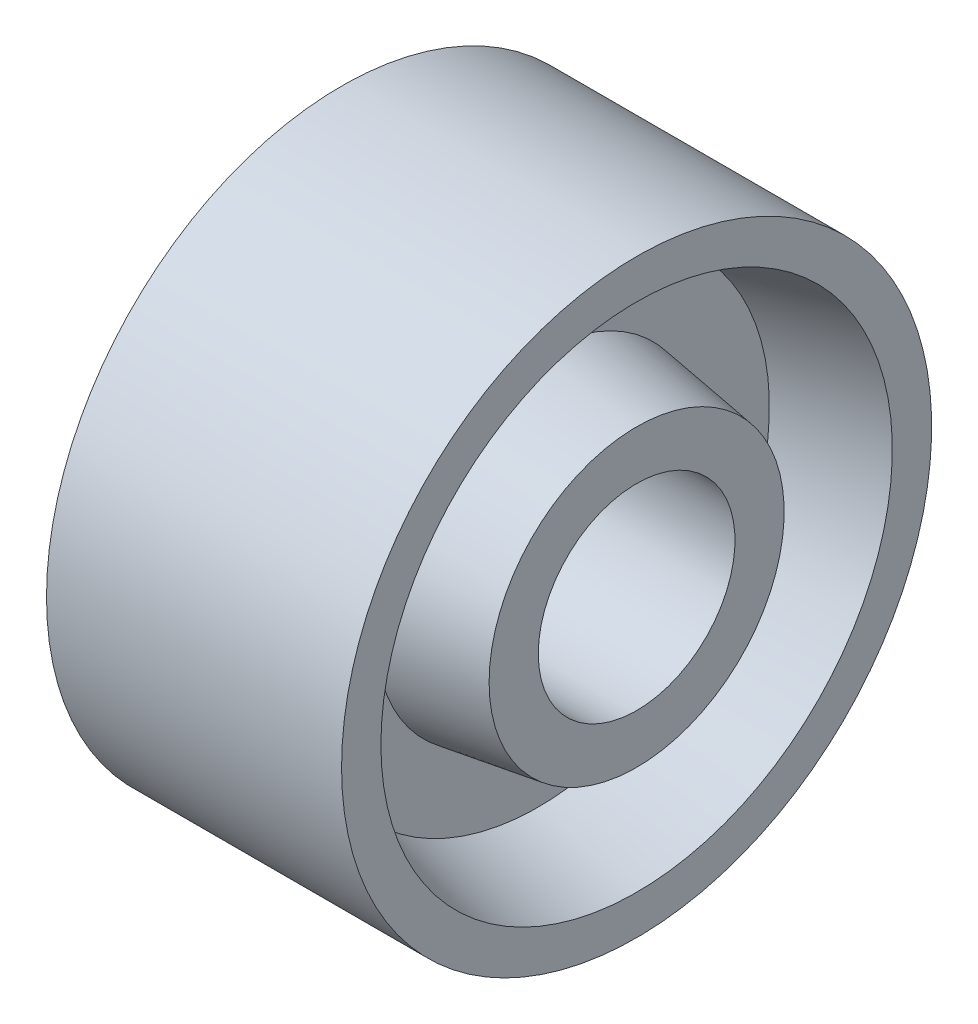
ISO-10303-21;
HEADER;
FILE_DESCRIPTION(('STEP AP214'),'2;1');
FILE_NAME('part.step','',(''),(''),'','','');
FILE_SCHEMA(('AUTOMOTIVE_DESIGN { 1 0 10303 214 1 1 1 1 }'));
ENDSEC;
DATA;
#1=APPLICATION_CONTEXT('core data for automotive mechanical design processes');
#2=APPLICATION_PROTOCOL_DEFINITION('international standard','automotive_design',2000,#1);
#3=PRODUCT_CONTEXT('',#1,'mechanical');
#4=PRODUCT('Part','Part','',(#3));
#5=PRODUCT_RELATED_PRODUCT_CATEGORY('part','',(#4));
#6=PRODUCT_DEFINITION_FORMATION('','',#4);
#7=PRODUCT_DEFINITION_CONTEXT('part definition',#1,'design');
#8=PRODUCT_DEFINITION('design','',#6,#7);
#9=PRODUCT_DEFINITION_SHAPE('','',#8);
#10=(LENGTH_UNIT() NAMED_UNIT(*) SI_UNIT(.MILLI.,.METRE.));
#11=(NAMED_UNIT(*) PLANE_ANGLE_UNIT() SI_UNIT($,.RADIAN.));
#12=(NAMED_UNIT(*) SI_UNIT($,.STERADIAN.) SOLID_ANGLE_UNIT());
#13=UNCERTAINTY_MEASURE_WITH_UNIT(LENGTH_MEASURE(1.E-05),#10,'distance_accuracy_value','');
#14=(GEOMETRIC_REPRESENTATION_CONTEXT(3) GLOBAL_UNCERTAINTY_ASSIGNED_CONTEXT((#13)) GLOBAL_UNIT_ASSIGNED_CONTEXT((#10,
#11,#12)) REPRESENTATION_CONTEXT('',''));
#15=CARTESIAN_POINT('',(0.,0.,0.));
#16=DIRECTION('',(0.,0.,1.));
#17=DIRECTION('',(1.,0.,0.));
#18=AXIS2_PLACEMENT_3D('',#15,#16,#17);
#19=CARTESIAN_POINT('',(0.,10.,0.));
#20=DIRECTION('',(1.,0.,0.));
#21=DIRECTION('',(0.,0.,-1.));
#22=AXIS2_PLACEMENT_3D('',#19,#20,#21);
#23=PLANE('',#22);
#24=CARTESIAN_POINT('',(0.,0.,0.));
#25=DIRECTION('',(-1.,0.,0.));
#26=DIRECTION('',(0.,0.,1.));
#27=AXIS2_PLACEMENT_3D('',#24,#25,#26);
#28=CIRCLE('',#27,10.);
#29=CARTESIAN_POINT('',(0.,0.,10.));
#30=VERTEX_POINT('',#29);
#31=EDGE_CURVE('E94',#30,#30,#28,.T.);
#32=ORIENTED_EDGE('',*,*,#31,.F.);
#33=EDGE_LOOP('',(#32));
#34=FACE_BOUND('',#33,.T.);
#35=CARTESIAN_POINT('',(0.,0.,0.));
#36=DIRECTION('',(-1.,0.,0.));
#37=DIRECTION('',(0.,0.,1.));
#38=AXIS2_PLACEMENT_3D('',#35,#36,#37);
#39=CIRCLE('',#38,15.);
#40=CARTESIAN_POINT('',(0.,0.,15.));
#41=VERTEX_POINT('',#40);
#42=EDGE_CURVE('E10',#41,#41,#39,.T.);
#43=ORIENTED_EDGE('',*,*,#42,.T.);
#44=EDGE_LOOP('',(#43));
#45=FACE_BOUND('',#44,.T.);
#46=ADVANCED_FACE('F43',(#34,#45),#23,.F.);
#47=CARTESIAN_POINT('',(10.,0.,0.));
#48=DIRECTION('',(1.,0.,0.));
#49=DIRECTION('',(0.,0.,-1.));
#50=AXIS2_PLACEMENT_3D('',#47,#48,#49);
#51=CONICAL_SURFACE('',#50,16.5,0.148889947609497);
#52=ORIENTED_EDGE('',*,*,#42,.F.);
#53=EDGE_LOOP('',(#52));
#54=FACE_BOUND('',#53,.T.);
#55=CARTESIAN_POINT('',(10.,0.,0.));
#56=DIRECTION('',(-1.,0.,0.));
#57=DIRECTION('',(0.,0.,1.));
#58=AXIS2_PLACEMENT_3D('',#55,#56,#57);
#59=CIRCLE('',#58,16.5);
#60=CARTESIAN_POINT('',(10.,0.,16.5));
#61=VERTEX_POINT('',#60);
#62=EDGE_CURVE('E50',#61,#61,#59,.T.);
#63=ORIENTED_EDGE('',*,*,#62,.T.);
#64=EDGE_LOOP('',(#63));
#65=FACE_BOUND('',#64,.T.);
#66=ADVANCED_FACE('F102',(#54,#65),#51,.T.);
#67=CARTESIAN_POINT('',(10.,16.5,0.));
#68=DIRECTION('',(1.,0.,0.));
#69=DIRECTION('',(0.,0.,-1.));
#70=AXIS2_PLACEMENT_3D('',#67,#68,#69);
#71=PLANE('',#70);
#72=ORIENTED_EDGE('',*,*,#62,.F.);
#73=EDGE_LOOP('',(#72));
#74=FACE_BOUND('',#73,.T.);
#75=CARTESIAN_POINT('',(10.,0.,0.));
#76=DIRECTION('',(-1.,0.,0.));
#77=DIRECTION('',(0.,0.,1.));
#78=AXIS2_PLACEMENT_3D('',#75,#76,#77);
#79=CIRCLE('',#78,23.5);
#80=CARTESIAN_POINT('',(10.,0.,23.5));
#81=VERTEX_POINT('',#80);
#82=EDGE_CURVE('E55',#81,#81,#79,.T.);
#83=ORIENTED_EDGE('',*,*,#82,.T.);
#84=EDGE_LOOP('',(#83));
#85=FACE_BOUND('',#84,.T.);
#86=ADVANCED_FACE('F106',(#74,#85),#71,.F.);
#87=CARTESIAN_POINT('',(0.,0.,0.));
#88=DIRECTION('',(-1.,0.,0.));
#89=DIRECTION('',(0.,0.,1.));
#90=AXIS2_PLACEMENT_3D('',#87,#88,#89);
#91=CONICAL_SURFACE('',#90,26.,0.244978663126864);
#92=ORIENTED_EDGE('',*,*,#82,.F.);
#93=EDGE_LOOP('',(#92));
#94=FACE_BOUND('',#93,.T.);
#95=CARTESIAN_POINT('',(0.,0.,0.));
#96=DIRECTION('',(-1.,0.,0.));
#97=DIRECTION('',(0.,0.,1.));
#98=AXIS2_PLACEMENT_3D('',#95,#96,#97);
#99=CIRCLE('',#98,26.);
#100=CARTESIAN_POINT('',(0.,0.,26.));
#101=VERTEX_POINT('',#100);
#102=EDGE_CURVE('E60',#101,#101,#99,.T.);
#103=ORIENTED_EDGE('',*,*,#102,.T.);
#104=EDGE_LOOP('',(#103));
#105=FACE_BOUND('',#104,.T.);
#106=ADVANCED_FACE('F111',(#94,#105),#91,.F.);
#107=CARTESIAN_POINT('',(0.,26.,0.));
#108=DIRECTION('',(1.,0.,0.));
#109=DIRECTION('',(0.,0.,-1.));
#110=AXIS2_PLACEMENT_3D('',#107,#108,#109);
#111=PLANE('',#110);
#112=ORIENTED_EDGE('',*,*,#102,.F.);
#113=EDGE_LOOP('',(#112));
#114=FACE_BOUND('',#113,.T.);
#115=CARTESIAN_POINT('',(0.,0.,0.));
#116=DIRECTION('',(-1.,0.,0.));
#117=DIRECTION('',(0.,0.,1.));
#118=AXIS2_PLACEMENT_3D('',#115,#116,#117);
#119=CIRCLE('',#118,30.);
#120=CARTESIAN_POINT('',(0.,0.,30.));
#121=VERTEX_POINT('',#120);
#122=EDGE_CURVE('E66',#121,#121,#119,.T.);
#123=ORIENTED_EDGE('',*,*,#122,.T.);
#124=EDGE_LOOP('',(#123));
#125=FACE_BOUND('',#124,.T.);
#126=ADVANCED_FACE('F117',(#114,#125),#111,.F.);
#127=CARTESIAN_POINT('',(0.,0.,0.));
#128=DIRECTION('',(-1.,0.,0.));
#129=DIRECTION('',(0.,0.,1.));
#130=AXIS2_PLACEMENT_3D('',#127,#128,#129);
#131=CYLINDRICAL_SURFACE('',#130,30.);
#132=ORIENTED_EDGE('',*,*,#122,.F.);
#133=EDGE_LOOP('',(#132));
#134=FACE_BOUND('',#133,.T.);
#135=CARTESIAN_POINT('',(30.,0.,0.));
#136=DIRECTION('',(-1.,0.,0.));
#137=DIRECTION('',(0.,0.,1.));
#138=AXIS2_PLACEMENT_3D('',#135,#136,#137);
#139=CIRCLE('',#138,30.);
#140=CARTESIAN_POINT('',(30.,0.,30.));
#141=VERTEX_POINT('',#140);
#142=EDGE_CURVE('E70',#141,#141,#139,.T.);
#143=ORIENTED_EDGE('',*,*,#142,.T.);
#144=EDGE_LOOP('',(#143));
#145=FACE_BOUND('',#144,.T.);
#146=ADVANCED_FACE('F121',(#134,#145),#131,.T.);
#147=CARTESIAN_POINT('',(30.,26.,0.));
#148=DIRECTION('',(-1.,0.,0.));
#149=DIRECTION('',(0.,0.,1.));
#150=AXIS2_PLACEMENT_3D('',#147,#148,#149);
#151=PLANE('',#150);
#152=ORIENTED_EDGE('',*,*,#142,.F.);
#153=EDGE_LOOP('',(#152));
#154=FACE_BOUND('',#153,.T.);
#155=CARTESIAN_POINT('',(30.,0.,0.));
#156=DIRECTION('',(-1.,0.,0.));
#157=DIRECTION('',(0.,0.,1.));
#158=AXIS2_PLACEMENT_3D('',#155,#156,#157);
#159=CIRCLE('',#158,26.);
#160=CARTESIAN_POINT('',(30.,0.,26.));
#161=VERTEX_POINT('',#160);
#162=EDGE_CURVE('E74',#161,#161,#159,.T.);
#163=ORIENTED_EDGE('',*,*,#162,.T.);
#164=EDGE_LOOP('',(#163));
#165=FACE_BOUND('',#164,.T.);
#166=ADVANCED_FACE('F125',(#154,#165),#151,.F.);
#167=CARTESIAN_POINT('',(20.,0.,0.));
#168=DIRECTION('',(1.,0.,0.));
#169=DIRECTION('',(0.,0.,-1.));
#170=AXIS2_PLACEMENT_3D('',#167,#168,#169);
#171=CONICAL_SURFACE('',#170,23.5,0.244978663126864);
#172=ORIENTED_EDGE('',*,*,#162,.F.);
#173=EDGE_LOOP('',(#172));
#174=FACE_BOUND('',#173,.T.);
#175=CARTESIAN_POINT('',(20.,0.,0.));
#176=DIRECTION('',(-1.,0.,0.));
#177=DIRECTION('',(0.,0.,1.));
#178=AXIS2_PLACEMENT_3D('',#175,#176,#177);
#179=CIRCLE('',#178,23.5);
#180=CARTESIAN_POINT('',(20.,0.,23.5));
#181=VERTEX_POINT('',#180);
#182=EDGE_CURVE('E78',#181,#181,#179,.T.);
#183=ORIENTED_EDGE('',*,*,#182,.T.);
#184=EDGE_LOOP('',(#183));
#185=FACE_BOUND('',#184,.T.);
#186=ADVANCED_FACE('F129',(#174,#185),#171,.F.);
#187=CARTESIAN_POINT('',(20.,16.5,0.));
#188=DIRECTION('',(-1.,0.,0.));
#189=DIRECTION('',(0.,0.,1.));
#190=AXIS2_PLACEMENT_3D('',#187,#188,#189);
#191=PLANE('',#190);
#192=ORIENTED_EDGE('',*,*,#182,.F.);
#193=EDGE_LOOP('',(#192));
#194=FACE_BOUND('',#193,.T.);
#195=CARTESIAN_POINT('',(20.,0.,0.));
#196=DIRECTION('',(-1.,0.,0.));
#197=DIRECTION('',(0.,0.,1.));
#198=AXIS2_PLACEMENT_3D('',#195,#196,#197);
#199=CIRCLE('',#198,16.5);
#200=CARTESIAN_POINT('',(20.,0.,16.5));
#201=VERTEX_POINT('',#200);
#202=EDGE_CURVE('E82',#201,#201,#199,.T.);
#203=ORIENTED_EDGE('',*,*,#202,.T.);
#204=EDGE_LOOP('',(#203));
#205=FACE_BOUND('',#204,.T.);
#206=ADVANCED_FACE('F133',(#194,#205),#191,.F.);
#207=CARTESIAN_POINT('',(30.,0.,0.));
#208=DIRECTION('',(-1.,0.,0.));
#209=DIRECTION('',(0.,0.,1.));
#210=AXIS2_PLACEMENT_3D('',#207,#208,#209);
#211=CONICAL_SURFACE('',#210,15.,0.148889947609497);
#212=ORIENTED_EDGE('',*,*,#202,.F.);
#213=EDGE_LOOP('',(#212));
#214=FACE_BOUND('',#213,.T.);
#215=CARTESIAN_POINT('',(30.,0.,0.));
#216=DIRECTION('',(-1.,0.,0.));
#217=DIRECTION('',(0.,0.,1.));
#218=AXIS2_PLACEMENT_3D('',#215,#216,#217);
#219=CIRCLE('',#218,15.);
#220=CARTESIAN_POINT('',(30.,0.,15.));
#221=VERTEX_POINT('',#220);
#222=EDGE_CURVE('E86',#221,#221,#219,.T.);
#223=ORIENTED_EDGE('',*,*,#222,.T.);
#224=EDGE_LOOP('',(#223));
#225=FACE_BOUND('',#224,.T.);
#226=ADVANCED_FACE('F137',(#214,#225),#211,.T.);
#227=CARTESIAN_POINT('',(30.,10.,0.));
#228=DIRECTION('',(-1.,0.,0.));
#229=DIRECTION('',(0.,0.,1.));
#230=AXIS2_PLACEMENT_3D('',#227,#228,#229);
#231=PLANE('',#230);
#232=ORIENTED_EDGE('',*,*,#222,.F.);
#233=EDGE_LOOP('',(#232));
#234=FACE_BOUND('',#233,.T.);
#235=CARTESIAN_POINT('',(30.,0.,0.));
#236=DIRECTION('',(-1.,0.,0.));
#237=DIRECTION('',(0.,0.,1.));
#238=AXIS2_PLACEMENT_3D('',#235,#236,#237);
#239=CIRCLE('',#238,10.);
#240=CARTESIAN_POINT('',(30.,0.,10.));
#241=VERTEX_POINT('',#240);
#242=EDGE_CURVE('E90',#241,#241,#239,.T.);
#243=ORIENTED_EDGE('',*,*,#242,.T.);
#244=EDGE_LOOP('',(#243));
#245=FACE_BOUND('',#244,.T.);
#246=ADVANCED_FACE('F141',(#234,#245),#231,.F.);
#247=CARTESIAN_POINT('',(0.,0.,0.));
#248=DIRECTION('',(-1.,0.,0.));
#249=DIRECTION('',(0.,0.,1.));
#250=AXIS2_PLACEMENT_3D('',#247,#248,#249);
#251=CYLINDRICAL_SURFACE('',#250,10.);
#252=ORIENTED_EDGE('',*,*,#242,.F.);
#253=EDGE_LOOP('',(#252));
#254=FACE_BOUND('',#253,.T.);
#255=ORIENTED_EDGE('',*,*,#31,.T.);
#256=EDGE_LOOP('',(#255));
#257=FACE_BOUND('',#256,.T.);
#258=ADVANCED_FACE('F99',(#254,#257),#251,.F.);
#259=CLOSED_SHELL('',(#46,#66,#86,#106,#126,#146,#166,#186,#206,#226,#246,#258));
#260=MANIFOLD_SOLID_BREP('B2',#259);
#261=ADVANCED_BREP_SHAPE_REPRESENTATION('',(#18,#260),#14);
#262=SHAPE_DEFINITION_REPRESENTATION(#9,#261);
ENDSEC;
END-ISO-10303-21;
